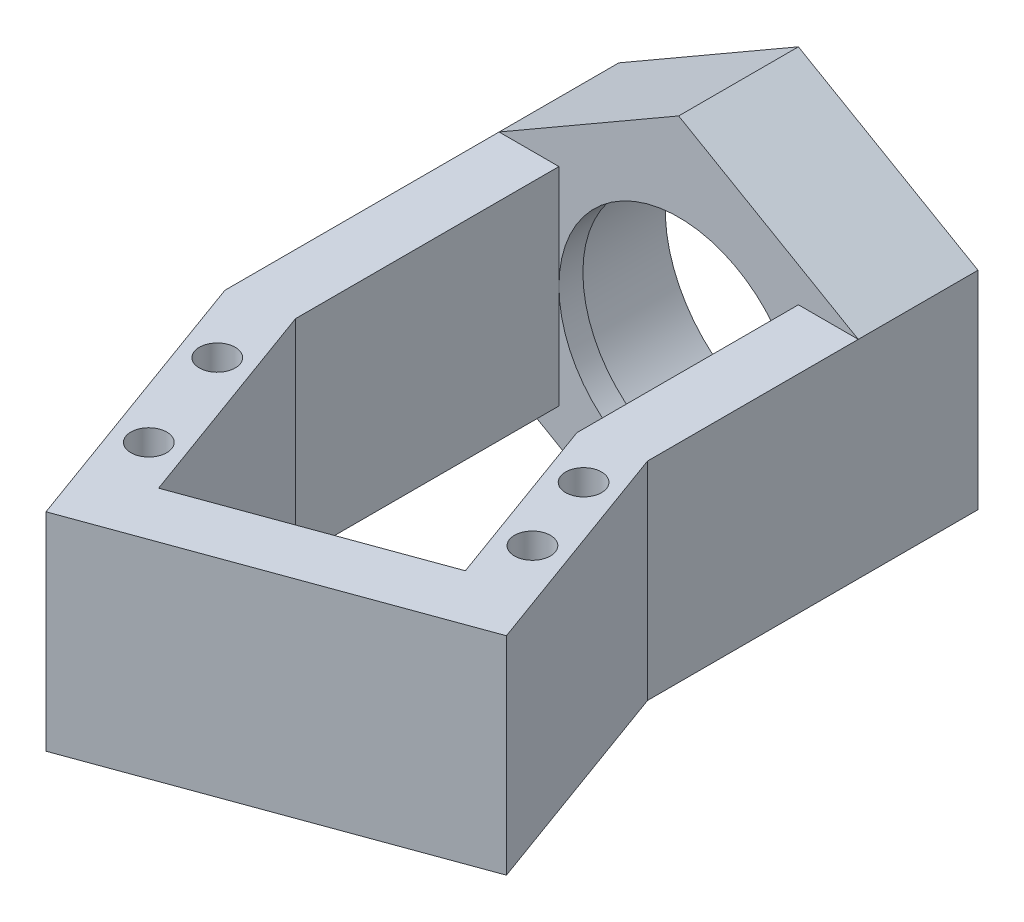
ISO-10303-21;
HEADER;
FILE_DESCRIPTION(('STEP AP214'),'2;1');
FILE_NAME('part.step','',(''),(''),'','','');
FILE_SCHEMA(('AUTOMOTIVE_DESIGN { 1 0 10303 214 1 1 1 1 }'));
ENDSEC;
DATA;
#1=APPLICATION_CONTEXT('core data for automotive mechanical design processes');
#2=APPLICATION_PROTOCOL_DEFINITION('international standard','automotive_design',2000,#1);
#3=PRODUCT_CONTEXT('',#1,'mechanical');
#4=PRODUCT('Part','Part','',(#3));
#5=PRODUCT_RELATED_PRODUCT_CATEGORY('part','',(#4));
#6=PRODUCT_DEFINITION_FORMATION('','',#4);
#7=PRODUCT_DEFINITION_CONTEXT('part definition',#1,'design');
#8=PRODUCT_DEFINITION('design','',#6,#7);
#9=PRODUCT_DEFINITION_SHAPE('','',#8);
#10=(LENGTH_UNIT() NAMED_UNIT(*) SI_UNIT(.MILLI.,.METRE.));
#11=(NAMED_UNIT(*) PLANE_ANGLE_UNIT() SI_UNIT($,.RADIAN.));
#12=(NAMED_UNIT(*) SI_UNIT($,.STERADIAN.) SOLID_ANGLE_UNIT());
#13=UNCERTAINTY_MEASURE_WITH_UNIT(LENGTH_MEASURE(1.E-05),#10,'distance_accuracy_value','');
#14=(GEOMETRIC_REPRESENTATION_CONTEXT(3) GLOBAL_UNCERTAINTY_ASSIGNED_CONTEXT((#13)) GLOBAL_UNIT_ASSIGNED_CONTEXT((#10,
#11,#12)) REPRESENTATION_CONTEXT('',''));
#15=CARTESIAN_POINT('',(0.,0.,0.));
#16=DIRECTION('',(0.,0.,1.));
#17=DIRECTION('',(1.,0.,0.));
#18=AXIS2_PLACEMENT_3D('',#15,#16,#17);
#19=CARTESIAN_POINT('',(0.,0.,10.));
#20=DIRECTION('',(0.,0.,1.));
#21=DIRECTION('',(1.,0.,0.));
#22=AXIS2_PLACEMENT_3D('',#19,#20,#21);
#23=PLANE('',#22);
#24=DIRECTION('',(0.866025403784439,0.5,0.));
#25=VECTOR('',#24,1.);
#26=CARTESIAN_POINT('',(0.,-17.3205080756888,10.));
#27=LINE('',#26,#25);
#28=CARTESIAN_POINT('',(0.,-17.3205080756888,10.));
#29=VERTEX_POINT('',#28);
#30=CARTESIAN_POINT('',(15.,-8.66025403784439,10.));
#31=VERTEX_POINT('',#30);
#32=EDGE_CURVE('E348',#29,#31,#27,.T.);
#33=ORIENTED_EDGE('',*,*,#32,.T.);
#34=DIRECTION('',(-1.,0.,0.));
#35=VECTOR('',#34,1.);
#36=CARTESIAN_POINT('',(10.,-8.66025403784439,10.));
#37=LINE('',#36,#35);
#38=CARTESIAN_POINT('',(10.,-8.66025403784439,10.));
#39=VERTEX_POINT('',#38);
#40=EDGE_CURVE('E64',#31,#39,#37,.T.);
#41=ORIENTED_EDGE('',*,*,#40,.T.);
#42=DIRECTION('',(0.,-1.,0.));
#43=VECTOR('',#42,1.);
#44=CARTESIAN_POINT('',(10.,8.66,10.));
#45=LINE('',#44,#43);
#46=CARTESIAN_POINT('',(10.,0.,10.));
#47=VERTEX_POINT('',#46);
#48=EDGE_CURVE('E11',#47,#39,#45,.T.);
#49=ORIENTED_EDGE('',*,*,#48,.F.);
#50=CARTESIAN_POINT('',(0.,0.,10.));
#51=DIRECTION('',(0.,0.,1.));
#52=DIRECTION('',(1.,0.,0.));
#53=AXIS2_PLACEMENT_3D('',#50,#51,#52);
#54=CIRCLE('',#53,10.);
#55=CARTESIAN_POINT('',(-9.99999999999999,0.,10.));
#56=VERTEX_POINT('',#55);
#57=EDGE_CURVE('E330',#56,#47,#54,.T.);
#58=ORIENTED_EDGE('',*,*,#57,.F.);
#59=DIRECTION('',(0.,-1.,0.));
#60=VECTOR('',#59,1.);
#61=CARTESIAN_POINT('',(-9.99999999999999,8.66,10.));
#62=LINE('',#61,#60);
#63=CARTESIAN_POINT('',(-9.99999999999999,-8.66025403784439,10.));
#64=VERTEX_POINT('',#63);
#65=EDGE_CURVE('E55',#56,#64,#62,.T.);
#66=ORIENTED_EDGE('',*,*,#65,.T.);
#67=DIRECTION('',(-1.,0.,0.));
#68=VECTOR('',#67,1.);
#69=CARTESIAN_POINT('',(-9.99999999999999,-8.66025403784439,10.));
#70=LINE('',#69,#68);
#71=CARTESIAN_POINT('',(-15.,-8.66025403784439,10.));
#72=VERTEX_POINT('',#71);
#73=EDGE_CURVE('E242',#64,#72,#70,.T.);
#74=ORIENTED_EDGE('',*,*,#73,.T.);
#75=DIRECTION('',(0.866025403784439,-0.5,0.));
#76=VECTOR('',#75,1.);
#77=CARTESIAN_POINT('',(-15.,-8.66025403784439,10.));
#78=LINE('',#77,#76);
#79=EDGE_CURVE('E344',#72,#29,#78,.T.);
#80=ORIENTED_EDGE('',*,*,#79,.T.);
#81=EDGE_LOOP('',(#33,#41,#49,#58,#66,#74,#80));
#82=FACE_BOUND('',#81,.T.);
#83=ADVANCED_FACE('F45',(#82),#23,.T.);
#84=CARTESIAN_POINT('',(10.,8.66,10.));
#85=VERTEX_POINT('',#84);
#86=EDGE_CURVE('E57',#85,#47,#45,.T.);
#87=ORIENTED_EDGE('',*,*,#86,.F.);
#88=DIRECTION('',(-1.,0.,0.));
#89=VECTOR('',#88,1.);
#90=CARTESIAN_POINT('',(10.,8.66,10.));
#91=LINE('',#90,#89);
#92=CARTESIAN_POINT('',(15.,8.66,10.));
#93=VERTEX_POINT('',#92);
#94=EDGE_CURVE('E255',#93,#85,#91,.T.);
#95=ORIENTED_EDGE('',*,*,#94,.F.);
#96=DIRECTION('',(0.,1.,0.));
#97=VECTOR('',#96,1.);
#98=CARTESIAN_POINT('',(15.,-8.66025403784439,10.));
#99=LINE('',#98,#97);
#100=CARTESIAN_POINT('',(15.,8.66025403784439,10.));
#101=VERTEX_POINT('',#100);
#102=EDGE_CURVE('E351',#93,#101,#99,.T.);
#103=ORIENTED_EDGE('',*,*,#102,.T.);
#104=DIRECTION('',(-0.866025403784439,0.5,0.));
#105=VECTOR('',#104,1.);
#106=CARTESIAN_POINT('',(15.,8.66025403784439,10.));
#107=LINE('',#106,#105);
#108=CARTESIAN_POINT('',(0.,17.3205080756888,10.));
#109=VERTEX_POINT('',#108);
#110=EDGE_CURVE('E329',#101,#109,#107,.T.);
#111=ORIENTED_EDGE('',*,*,#110,.T.);
#112=DIRECTION('',(-0.866025403784439,-0.5,0.));
#113=VECTOR('',#112,1.);
#114=CARTESIAN_POINT('',(0.,17.3205080756888,10.));
#115=LINE('',#114,#113);
#116=CARTESIAN_POINT('',(-15.,8.66025403784439,10.));
#117=VERTEX_POINT('',#116);
#118=EDGE_CURVE('E337',#109,#117,#115,.T.);
#119=ORIENTED_EDGE('',*,*,#118,.T.);
#120=DIRECTION('',(0.,-1.,0.));
#121=VECTOR('',#120,1.);
#122=CARTESIAN_POINT('',(-15.,8.66025403784439,10.));
#123=LINE('',#122,#121);
#124=CARTESIAN_POINT('',(-15.,8.66,10.));
#125=VERTEX_POINT('',#124);
#126=EDGE_CURVE('E341',#117,#125,#123,.T.);
#127=ORIENTED_EDGE('',*,*,#126,.T.);
#128=DIRECTION('',(-1.,0.,0.));
#129=VECTOR('',#128,1.);
#130=CARTESIAN_POINT('',(-9.99999999999999,8.66,10.));
#131=LINE('',#130,#129);
#132=CARTESIAN_POINT('',(-9.99999999999999,8.66,10.));
#133=VERTEX_POINT('',#132);
#134=EDGE_CURVE('E310',#133,#125,#131,.T.);
#135=ORIENTED_EDGE('',*,*,#134,.F.);
#136=EDGE_CURVE('E294',#133,#56,#62,.T.);
#137=ORIENTED_EDGE('',*,*,#136,.T.);
#138=EDGE_CURVE('E325',#47,#56,#54,.T.);
#139=ORIENTED_EDGE('',*,*,#138,.F.);
#140=EDGE_LOOP('',(#87,#95,#103,#111,#119,#127,#135,#137,#139));
#141=FACE_BOUND('',#140,.T.);
#142=ADVANCED_FACE('F432',(#141),#23,.T.);
#143=CARTESIAN_POINT('',(0.,0.,0.));
#144=DIRECTION('',(0.,0.,1.));
#145=DIRECTION('',(1.,0.,0.));
#146=AXIS2_PLACEMENT_3D('',#143,#144,#145);
#147=PLANE('',#146);
#148=DIRECTION('',(-0.866025403784439,0.5,0.));
#149=VECTOR('',#148,1.);
#150=CARTESIAN_POINT('',(15.,8.66025403784439,0.));
#151=LINE('',#150,#149);
#152=CARTESIAN_POINT('',(15.,8.66025403784439,0.));
#153=VERTEX_POINT('',#152);
#154=CARTESIAN_POINT('',(0.,17.3205080756888,0.));
#155=VERTEX_POINT('',#154);
#156=EDGE_CURVE('E362',#153,#155,#151,.T.);
#157=ORIENTED_EDGE('',*,*,#156,.F.);
#158=DIRECTION('',(0.,1.,0.));
#159=VECTOR('',#158,1.);
#160=CARTESIAN_POINT('',(15.,-8.66025403784439,0.));
#161=LINE('',#160,#159);
#162=CARTESIAN_POINT('',(15.,-8.66025403784439,0.));
#163=VERTEX_POINT('',#162);
#164=EDGE_CURVE('E378',#163,#153,#161,.T.);
#165=ORIENTED_EDGE('',*,*,#164,.F.);
#166=DIRECTION('',(0.866025403784439,0.5,0.));
#167=VECTOR('',#166,1.);
#168=CARTESIAN_POINT('',(0.,-17.3205080756888,0.));
#169=LINE('',#168,#167);
#170=CARTESIAN_POINT('',(0.,-17.3205080756888,0.));
#171=VERTEX_POINT('',#170);
#172=EDGE_CURVE('E375',#171,#163,#169,.T.);
#173=ORIENTED_EDGE('',*,*,#172,.F.);
#174=DIRECTION('',(0.866025403784439,-0.5,0.));
#175=VECTOR('',#174,1.);
#176=CARTESIAN_POINT('',(-15.,-8.66025403784439,0.));
#177=LINE('',#176,#175);
#178=CARTESIAN_POINT('',(-15.,-8.66025403784439,0.));
#179=VERTEX_POINT('',#178);
#180=EDGE_CURVE('E372',#179,#171,#177,.T.);
#181=ORIENTED_EDGE('',*,*,#180,.F.);
#182=DIRECTION('',(0.,-1.,0.));
#183=VECTOR('',#182,1.);
#184=CARTESIAN_POINT('',(-15.,8.66025403784439,0.));
#185=LINE('',#184,#183);
#186=CARTESIAN_POINT('',(-15.,8.66025403784439,0.));
#187=VERTEX_POINT('',#186);
#188=EDGE_CURVE('E369',#187,#179,#185,.T.);
#189=ORIENTED_EDGE('',*,*,#188,.F.);
#190=DIRECTION('',(-0.866025403784439,-0.5,0.));
#191=VECTOR('',#190,1.);
#192=CARTESIAN_POINT('',(0.,17.3205080756888,0.));
#193=LINE('',#192,#191);
#194=EDGE_CURVE('E366',#155,#187,#193,.T.);
#195=ORIENTED_EDGE('',*,*,#194,.F.);
#196=EDGE_LOOP('',(#157,#165,#173,#181,#189,#195));
#197=FACE_BOUND('',#196,.T.);
#198=CARTESIAN_POINT('',(0.,0.,0.));
#199=DIRECTION('',(0.,0.,1.));
#200=DIRECTION('',(1.,0.,0.));
#201=AXIS2_PLACEMENT_3D('',#198,#199,#200);
#202=CIRCLE('',#201,11.125);
#203=CARTESIAN_POINT('',(11.125,0.,0.));
#204=VERTEX_POINT('',#203);
#205=EDGE_CURVE('E358',#204,#204,#202,.T.);
#206=ORIENTED_EDGE('',*,*,#205,.T.);
#207=EDGE_LOOP('',(#206));
#208=FACE_BOUND('',#207,.T.);
#209=ADVANCED_FACE('F438',(#197,#208),#147,.F.);
#210=CARTESIAN_POINT('',(15.,8.66025403784439,8.));
#211=DIRECTION('',(-0.5,-0.866025403784439,0.));
#212=DIRECTION('',(0.866025403784439,-0.5,0.));
#213=AXIS2_PLACEMENT_3D('',#210,#211,#212);
#214=PLANE('',#213);
#215=ORIENTED_EDGE('',*,*,#156,.T.);
#216=DIRECTION('',(0.,0.,-1.));
#217=VECTOR('',#216,1.);
#218=CARTESIAN_POINT('',(0.,17.3205080756888,8.));
#219=LINE('',#218,#217);
#220=EDGE_CURVE('E401',#109,#155,#219,.T.);
#221=ORIENTED_EDGE('',*,*,#220,.F.);
#222=ORIENTED_EDGE('',*,*,#110,.F.);
#223=DIRECTION('',(0.,0.,-1.));
#224=VECTOR('',#223,1.);
#225=CARTESIAN_POINT('',(15.,8.66025403784439,8.));
#226=LINE('',#225,#224);
#227=EDGE_CURVE('E381',#101,#153,#226,.T.);
#228=ORIENTED_EDGE('',*,*,#227,.T.);
#229=EDGE_LOOP('',(#215,#221,#222,#228));
#230=FACE_BOUND('',#229,.T.);
#231=ADVANCED_FACE('F47',(#230),#214,.F.);
#232=CARTESIAN_POINT('',(0.,17.3205080756888,8.));
#233=DIRECTION('',(0.5,-0.866025403784439,0.));
#234=DIRECTION('',(0.866025403784439,0.5,0.));
#235=AXIS2_PLACEMENT_3D('',#232,#233,#234);
#236=PLANE('',#235);
#237=ORIENTED_EDGE('',*,*,#194,.T.);
#238=DIRECTION('',(0.,0.,-1.));
#239=VECTOR('',#238,1.);
#240=CARTESIAN_POINT('',(-15.,8.66025403784439,8.));
#241=LINE('',#240,#239);
#242=EDGE_CURVE('E397',#117,#187,#241,.T.);
#243=ORIENTED_EDGE('',*,*,#242,.F.);
#244=ORIENTED_EDGE('',*,*,#118,.F.);
#245=ORIENTED_EDGE('',*,*,#220,.T.);
#246=EDGE_LOOP('',(#237,#243,#244,#245));
#247=FACE_BOUND('',#246,.T.);
#248=ADVANCED_FACE('F468',(#247),#236,.F.);
#249=CARTESIAN_POINT('',(-15.,8.66025403784439,8.));
#250=DIRECTION('',(1.,0.,0.));
#251=DIRECTION('',(0.,1.,0.));
#252=AXIS2_PLACEMENT_3D('',#249,#250,#251);
#253=PLANE('',#252);
#254=ORIENTED_EDGE('',*,*,#188,.T.);
#255=DIRECTION('',(0.,0.,-1.));
#256=VECTOR('',#255,1.);
#257=CARTESIAN_POINT('',(-15.,-8.66025403784439,8.));
#258=LINE('',#257,#256);
#259=EDGE_CURVE('E393',#72,#179,#258,.T.);
#260=ORIENTED_EDGE('',*,*,#259,.F.);
#261=DIRECTION('',(0.,0.,1.));
#262=VECTOR('',#261,1.);
#263=CARTESIAN_POINT('',(-15.,-8.66025403784439,10.));
#264=LINE('',#263,#262);
#265=CARTESIAN_POINT('',(-15.,-8.66025403784439,32.9));
#266=VERTEX_POINT('',#265);
#267=EDGE_CURVE('E185',#72,#266,#264,.T.);
#268=ORIENTED_EDGE('',*,*,#267,.T.);
#269=DIRECTION('',(0.,-1.,0.));
#270=VECTOR('',#269,1.);
#271=CARTESIAN_POINT('',(-15.,8.66,32.9));
#272=LINE('',#271,#270);
#273=CARTESIAN_POINT('',(-15.,8.66,32.9));
#274=VERTEX_POINT('',#273);
#275=EDGE_CURVE('E180',#274,#266,#272,.T.);
#276=ORIENTED_EDGE('',*,*,#275,.F.);
#277=DIRECTION('',(0.,0.,1.));
#278=VECTOR('',#277,1.);
#279=CARTESIAN_POINT('',(-15.,8.66,10.));
#280=LINE('',#279,#278);
#281=EDGE_CURVE('E307',#125,#274,#280,.T.);
#282=ORIENTED_EDGE('',*,*,#281,.F.);
#283=ORIENTED_EDGE('',*,*,#126,.F.);
#284=ORIENTED_EDGE('',*,*,#242,.T.);
#285=EDGE_LOOP('',(#254,#260,#268,#276,#282,#283,#284));
#286=FACE_BOUND('',#285,.T.);
#287=ADVANCED_FACE('F465',(#286),#253,.F.);
#288=CARTESIAN_POINT('',(-15.,-8.66025403784439,8.));
#289=DIRECTION('',(0.5,0.866025403784439,0.));
#290=DIRECTION('',(-0.866025403784439,0.5,0.));
#291=AXIS2_PLACEMENT_3D('',#288,#289,#290);
#292=PLANE('',#291);
#293=ORIENTED_EDGE('',*,*,#180,.T.);
#294=DIRECTION('',(0.,0.,-1.));
#295=VECTOR('',#294,1.);
#296=CARTESIAN_POINT('',(0.,-17.3205080756888,8.));
#297=LINE('',#296,#295);
#298=EDGE_CURVE('E389',#29,#171,#297,.T.);
#299=ORIENTED_EDGE('',*,*,#298,.F.);
#300=ORIENTED_EDGE('',*,*,#79,.F.);
#301=ORIENTED_EDGE('',*,*,#259,.T.);
#302=EDGE_LOOP('',(#293,#299,#300,#301));
#303=FACE_BOUND('',#302,.T.);
#304=ADVANCED_FACE('F461',(#303),#292,.F.);
#305=CARTESIAN_POINT('',(0.,-17.3205080756888,8.));
#306=DIRECTION('',(-0.5,0.866025403784439,0.));
#307=DIRECTION('',(-0.866025403784439,-0.5,0.));
#308=AXIS2_PLACEMENT_3D('',#305,#306,#307);
#309=PLANE('',#308);
#310=ORIENTED_EDGE('',*,*,#172,.T.);
#311=DIRECTION('',(0.,0.,-1.));
#312=VECTOR('',#311,1.);
#313=CARTESIAN_POINT('',(15.,-8.66025403784439,8.));
#314=LINE('',#313,#312);
#315=EDGE_CURVE('E385',#31,#163,#314,.T.);
#316=ORIENTED_EDGE('',*,*,#315,.F.);
#317=ORIENTED_EDGE('',*,*,#32,.F.);
#318=ORIENTED_EDGE('',*,*,#298,.T.);
#319=EDGE_LOOP('',(#310,#316,#317,#318));
#320=FACE_BOUND('',#319,.T.);
#321=ADVANCED_FACE('F457',(#320),#309,.F.);
#322=CARTESIAN_POINT('',(15.,-8.66025403784439,8.));
#323=DIRECTION('',(-1.,0.,0.));
#324=DIRECTION('',(0.,-1.,0.));
#325=AXIS2_PLACEMENT_3D('',#322,#323,#324);
#326=PLANE('',#325);
#327=ORIENTED_EDGE('',*,*,#164,.T.);
#328=ORIENTED_EDGE('',*,*,#227,.F.);
#329=ORIENTED_EDGE('',*,*,#102,.F.);
#330=DIRECTION('',(0.,0.,-1.));
#331=VECTOR('',#330,1.);
#332=CARTESIAN_POINT('',(15.,8.66,10.));
#333=LINE('',#332,#331);
#334=CARTESIAN_POINT('',(15.,8.66,27.6));
#335=VERTEX_POINT('',#334);
#336=EDGE_CURVE('E268',#335,#93,#333,.T.);
#337=ORIENTED_EDGE('',*,*,#336,.F.);
#338=DIRECTION('',(0.,-1.,0.));
#339=VECTOR('',#338,1.);
#340=CARTESIAN_POINT('',(15.,8.66,27.6));
#341=LINE('',#340,#339);
#342=CARTESIAN_POINT('',(15.,-8.66025403784439,27.6));
#343=VERTEX_POINT('',#342);
#344=EDGE_CURVE('E272',#335,#343,#341,.T.);
#345=ORIENTED_EDGE('',*,*,#344,.T.);
#346=DIRECTION('',(0.,0.,-1.));
#347=VECTOR('',#346,1.);
#348=CARTESIAN_POINT('',(15.,-8.66025403784439,10.));
#349=LINE('',#348,#347);
#350=EDGE_CURVE('E251',#343,#31,#349,.T.);
#351=ORIENTED_EDGE('',*,*,#350,.T.);
#352=ORIENTED_EDGE('',*,*,#315,.T.);
#353=EDGE_LOOP('',(#327,#328,#329,#337,#345,#351,#352));
#354=FACE_BOUND('',#353,.T.);
#355=ADVANCED_FACE('F450',(#354),#326,.F.);
#356=CARTESIAN_POINT('',(0.,0.,8.));
#357=DIRECTION('',(0.,0.,-1.));
#358=DIRECTION('',(-1.,0.,0.));
#359=AXIS2_PLACEMENT_3D('',#356,#357,#358);
#360=CYLINDRICAL_SURFACE('',#359,11.125);
#361=CARTESIAN_POINT('',(0.,0.,8.));
#362=DIRECTION('',(0.,0.,1.));
#363=DIRECTION('',(1.,0.,0.));
#364=AXIS2_PLACEMENT_3D('',#361,#362,#363);
#365=CIRCLE('',#364,11.125);
#366=CARTESIAN_POINT('',(11.125,0.,8.));
#367=VERTEX_POINT('',#366);
#368=EDGE_CURVE('E354',#367,#367,#365,.T.);
#369=ORIENTED_EDGE('',*,*,#368,.T.);
#370=EDGE_LOOP('',(#369));
#371=FACE_BOUND('',#370,.T.);
#372=ORIENTED_EDGE('',*,*,#205,.F.);
#373=EDGE_LOOP('',(#372));
#374=FACE_BOUND('',#373,.T.);
#375=ADVANCED_FACE('F446',(#371,#374),#360,.F.);
#376=CARTESIAN_POINT('',(0.,0.,8.));
#377=DIRECTION('',(0.,0.,1.));
#378=DIRECTION('',(1.,0.,0.));
#379=AXIS2_PLACEMENT_3D('',#376,#377,#378);
#380=PLANE('',#379);
#381=CARTESIAN_POINT('',(0.,0.,8.));
#382=DIRECTION('',(0.,0.,1.));
#383=DIRECTION('',(1.,0.,0.));
#384=AXIS2_PLACEMENT_3D('',#381,#382,#383);
#385=CIRCLE('',#384,10.);
#386=CARTESIAN_POINT('',(10.,0.,8.));
#387=VERTEX_POINT('',#386);
#388=EDGE_CURVE('E284',#387,#387,#385,.T.);
#389=ORIENTED_EDGE('',*,*,#388,.T.);
#390=EDGE_LOOP('',(#389));
#391=FACE_BOUND('',#390,.T.);
#392=ORIENTED_EDGE('',*,*,#368,.F.);
#393=EDGE_LOOP('',(#392));
#394=FACE_BOUND('',#393,.T.);
#395=ADVANCED_FACE('F444',(#391,#394),#380,.F.);
#396=CARTESIAN_POINT('',(0.,0.,10.));
#397=DIRECTION('',(0.,0.,-1.));
#398=DIRECTION('',(-1.,0.,0.));
#399=AXIS2_PLACEMENT_3D('',#396,#397,#398);
#400=CYLINDRICAL_SURFACE('',#399,10.);
#401=ORIENTED_EDGE('',*,*,#138,.T.);
#402=ORIENTED_EDGE('',*,*,#57,.T.);
#403=EDGE_LOOP('',(#401,#402));
#404=FACE_BOUND('',#403,.T.);
#405=ORIENTED_EDGE('',*,*,#388,.F.);
#406=EDGE_LOOP('',(#405));
#407=FACE_BOUND('',#406,.T.);
#408=ADVANCED_FACE('F442',(#404,#407),#400,.F.);
#409=CARTESIAN_POINT('',(-15.,8.66,32.9));
#410=DIRECTION('',(0.939692620785908,0.,-0.34202014332567));
#411=DIRECTION('',(-0.34202014332567,0.,-0.939692620785908));
#412=AXIS2_PLACEMENT_3D('',#409,#410,#411);
#413=PLANE('',#412);
#414=ORIENTED_EDGE('',*,*,#275,.T.);
#415=DIRECTION('',(0.34202014332567,0.,0.939692620785908));
#416=VECTOR('',#415,1.);
#417=CARTESIAN_POINT('',(-15.,-8.66025403784439,32.9));
#418=LINE('',#417,#416);
#419=CARTESIAN_POINT('',(-6.44949641685823,-8.66025403784439,56.3923155196477));
#420=VERTEX_POINT('',#419);
#421=EDGE_CURVE('E173',#266,#420,#418,.T.);
#422=ORIENTED_EDGE('',*,*,#421,.T.);
#423=DIRECTION('',(0.,-1.,0.));
#424=VECTOR('',#423,1.);
#425=CARTESIAN_POINT('',(-6.44949641685823,-8.66025403784439,56.3923155196477));
#426=LINE('',#425,#424);
#427=CARTESIAN_POINT('',(-6.44949641685823,8.66,56.3923155196477));
#428=VERTEX_POINT('',#427);
#429=EDGE_CURVE('E178',#428,#420,#426,.T.);
#430=ORIENTED_EDGE('',*,*,#429,.F.);
#431=DIRECTION('',(0.34202014332567,0.,0.939692620785908));
#432=VECTOR('',#431,1.);
#433=CARTESIAN_POINT('',(-15.,8.66,32.9));
#434=LINE('',#433,#432);
#435=EDGE_CURVE('E304',#274,#428,#434,.T.);
#436=ORIENTED_EDGE('',*,*,#435,.F.);
#437=EDGE_LOOP('',(#414,#422,#430,#436));
#438=FACE_BOUND('',#437,.T.);
#439=ADVANCED_FACE('F175',(#438),#413,.F.);
#440=CARTESIAN_POINT('',(-3.4552316013302,8.66,49.9816033909053));
#441=DIRECTION('',(-0.939692620785908,0.,0.342020143325671));
#442=DIRECTION('',(0.342020143325671,0.,0.939692620785908));
#443=AXIS2_PLACEMENT_3D('',#440,#441,#442);
#444=PLANE('',#443);
#445=DIRECTION('',(0.,-1.,0.));
#446=VECTOR('',#445,1.);
#447=CARTESIAN_POINT('',(-3.4552316013302,8.66,49.9816033909053));
#448=LINE('',#447,#446);
#449=CARTESIAN_POINT('',(-3.4552316013302,8.66,49.9816033909053));
#450=VERTEX_POINT('',#449);
#451=CARTESIAN_POINT('',(-3.4552316013302,-8.66025403784439,49.9816033909053));
#452=VERTEX_POINT('',#451);
#453=EDGE_CURVE('E287',#450,#452,#448,.T.);
#454=ORIENTED_EDGE('',*,*,#453,.T.);
#455=DIRECTION('',(-0.342020143325671,0.,-0.939692620785908));
#456=VECTOR('',#455,1.);
#457=CARTESIAN_POINT('',(-3.4552316013302,-8.66025403784439,49.9816033909053));
#458=LINE('',#457,#456);
#459=CARTESIAN_POINT('',(-9.99999999999999,-8.66025403784439,32.));
#460=VERTEX_POINT('',#459);
#461=EDGE_CURVE('E186',#452,#460,#458,.T.);
#462=ORIENTED_EDGE('',*,*,#461,.T.);
#463=DIRECTION('',(0.,-1.,0.));
#464=VECTOR('',#463,1.);
#465=CARTESIAN_POINT('',(-9.99999999999999,8.66,32.));
#466=LINE('',#465,#464);
#467=CARTESIAN_POINT('',(-9.99999999999999,8.66,32.));
#468=VERTEX_POINT('',#467);
#469=EDGE_CURVE('E291',#468,#460,#466,.T.);
#470=ORIENTED_EDGE('',*,*,#469,.F.);
#471=DIRECTION('',(-0.342020143325671,0.,-0.939692620785908));
#472=VECTOR('',#471,1.);
#473=CARTESIAN_POINT('',(-3.4552316013302,8.66,49.9816033909053));
#474=LINE('',#473,#472);
#475=EDGE_CURVE('E301',#450,#468,#474,.T.);
#476=ORIENTED_EDGE('',*,*,#475,.F.);
#477=EDGE_LOOP('',(#454,#462,#470,#476));
#478=FACE_BOUND('',#477,.T.);
#479=ADVANCED_FACE('F505',(#478),#444,.F.);
#480=CARTESIAN_POINT('',(-9.99999999999999,8.66,32.));
#481=DIRECTION('',(-1.,0.,0.));
#482=DIRECTION('',(0.,0.,1.));
#483=AXIS2_PLACEMENT_3D('',#480,#481,#482);
#484=PLANE('',#483);
#485=ORIENTED_EDGE('',*,*,#469,.T.);
#486=DIRECTION('',(0.,0.,-1.));
#487=VECTOR('',#486,1.);
#488=CARTESIAN_POINT('',(-9.99999999999999,-8.66025403784439,32.));
#489=LINE('',#488,#487);
#490=EDGE_CURVE('E314',#460,#64,#489,.T.);
#491=ORIENTED_EDGE('',*,*,#490,.T.);
#492=ORIENTED_EDGE('',*,*,#65,.F.);
#493=ORIENTED_EDGE('',*,*,#136,.F.);
#494=DIRECTION('',(0.,0.,-1.));
#495=VECTOR('',#494,1.);
#496=CARTESIAN_POINT('',(-9.99999999999999,8.66,32.));
#497=LINE('',#496,#495);
#498=EDGE_CURVE('E297',#468,#133,#497,.T.);
#499=ORIENTED_EDGE('',*,*,#498,.F.);
#500=EDGE_LOOP('',(#485,#491,#492,#493,#499));
#501=FACE_BOUND('',#500,.T.);
#502=ADVANCED_FACE('F500',(#501),#484,.F.);
#503=CARTESIAN_POINT('',(10.,8.66,28.5));
#504=DIRECTION('',(1.,0.,0.));
#505=DIRECTION('',(0.,0.,-1.));
#506=AXIS2_PLACEMENT_3D('',#503,#504,#505);
#507=PLANE('',#506);
#508=ORIENTED_EDGE('',*,*,#86,.T.);
#509=ORIENTED_EDGE('',*,*,#48,.T.);
#510=DIRECTION('',(0.,0.,1.));
#511=VECTOR('',#510,1.);
#512=CARTESIAN_POINT('',(10.,-8.66025403784439,28.5));
#513=LINE('',#512,#511);
#514=CARTESIAN_POINT('',(10.,-8.66025403784439,28.5));
#515=VERTEX_POINT('',#514);
#516=EDGE_CURVE('E241',#39,#515,#513,.T.);
#517=ORIENTED_EDGE('',*,*,#516,.T.);
#518=DIRECTION('',(0.,-1.,0.));
#519=VECTOR('',#518,1.);
#520=CARTESIAN_POINT('',(10.,8.66,28.5));
#521=LINE('',#520,#519);
#522=CARTESIAN_POINT('',(10.,8.66,28.5));
#523=VERTEX_POINT('',#522);
#524=EDGE_CURVE('E279',#523,#515,#521,.T.);
#525=ORIENTED_EDGE('',*,*,#524,.F.);
#526=DIRECTION('',(0.,0.,1.));
#527=VECTOR('',#526,1.);
#528=CARTESIAN_POINT('',(10.,8.66,28.5));
#529=LINE('',#528,#527);
#530=EDGE_CURVE('E259',#85,#523,#529,.T.);
#531=ORIENTED_EDGE('',*,*,#530,.F.);
#532=EDGE_LOOP('',(#508,#509,#517,#525,#531));
#533=FACE_BOUND('',#532,.T.);
#534=ADVANCED_FACE('F517',(#533),#507,.F.);
#535=CARTESIAN_POINT('',(15.330091146811,8.66,43.1443050694981));
#536=DIRECTION('',(0.939692620785908,0.,-0.34202014332567));
#537=DIRECTION('',(-0.34202014332567,0.,-0.939692620785908));
#538=AXIS2_PLACEMENT_3D('',#535,#536,#537);
#539=PLANE('',#538);
#540=ORIENTED_EDGE('',*,*,#524,.T.);
#541=DIRECTION('',(0.34202014332567,0.,0.939692620785908));
#542=VECTOR('',#541,1.);
#543=CARTESIAN_POINT('',(15.330091146811,-8.66025403784439,43.1443050694981));
#544=LINE('',#543,#542);
#545=CARTESIAN_POINT('',(15.330091146811,-8.66025403784439,43.1443050694981));
#546=VERTEX_POINT('',#545);
#547=EDGE_CURVE('E246',#515,#546,#544,.T.);
#548=ORIENTED_EDGE('',*,*,#547,.T.);
#549=DIRECTION('',(0.,-1.,0.));
#550=VECTOR('',#549,1.);
#551=CARTESIAN_POINT('',(15.330091146811,8.66,43.1443050694981));
#552=LINE('',#551,#550);
#553=CARTESIAN_POINT('',(15.330091146811,8.66,43.1443050694981));
#554=VERTEX_POINT('',#553);
#555=EDGE_CURVE('E275',#554,#546,#552,.T.);
#556=ORIENTED_EDGE('',*,*,#555,.F.);
#557=DIRECTION('',(0.34202014332567,0.,0.939692620785908));
#558=VECTOR('',#557,1.);
#559=CARTESIAN_POINT('',(15.330091146811,8.66,43.1443050694981));
#560=LINE('',#559,#558);
#561=EDGE_CURVE('E262',#523,#554,#560,.T.);
#562=ORIENTED_EDGE('',*,*,#561,.F.);
#563=EDGE_LOOP('',(#540,#548,#556,#562));
#564=FACE_BOUND('',#563,.T.);
#565=ADVANCED_FACE('F513',(#564),#539,.F.);
#566=CARTESIAN_POINT('',(15.,8.66,27.6));
#567=DIRECTION('',(-0.939692620785908,0.,0.342020143325671));
#568=DIRECTION('',(0.342020143325671,0.,0.939692620785908));
#569=AXIS2_PLACEMENT_3D('',#566,#567,#568);
#570=PLANE('',#569);
#571=DIRECTION('',(-0.342020143325671,0.,-0.939692620785908));
#572=VECTOR('',#571,1.);
#573=CARTESIAN_POINT('',(15.,8.66,27.6));
#574=LINE('',#573,#572);
#575=CARTESIAN_POINT('',(21.7445573955957,8.66,46.1305191486149));
#576=VERTEX_POINT('',#575);
#577=EDGE_CURVE('E265',#576,#335,#574,.T.);
#578=ORIENTED_EDGE('',*,*,#577,.F.);
#579=DIRECTION('',(0.,1.,0.));
#580=VECTOR('',#579,1.);
#581=CARTESIAN_POINT('',(21.7445573955957,8.66,46.1305191486149));
#582=LINE('',#581,#580);
#583=CARTESIAN_POINT('',(21.7445573955957,-8.66025403784439,46.1305191486149));
#584=VERTEX_POINT('',#583);
#585=EDGE_CURVE('E199',#584,#576,#582,.T.);
#586=ORIENTED_EDGE('',*,*,#585,.F.);
#587=DIRECTION('',(-0.342020143325671,0.,-0.939692620785908));
#588=VECTOR('',#587,1.);
#589=CARTESIAN_POINT('',(15.,-8.66025403784439,27.6));
#590=LINE('',#589,#588);
#591=EDGE_CURVE('E194',#584,#343,#590,.T.);
#592=ORIENTED_EDGE('',*,*,#591,.T.);
#593=ORIENTED_EDGE('',*,*,#344,.F.);
#594=EDGE_LOOP('',(#578,#586,#592,#593));
#595=FACE_BOUND('',#594,.T.);
#596=ADVANCED_FACE('F494',(#595),#570,.F.);
#597=CARTESIAN_POINT('',(0.,8.66,0.));
#598=DIRECTION('',(0.,-1.,0.));
#599=DIRECTION('',(0.,0.,-1.));
#600=AXIS2_PLACEMENT_3D('',#597,#598,#599);
#601=PLANE('',#600);
#602=CARTESIAN_POINT('',(16.3141933395865,8.66,38.5294100739481));
#603=DIRECTION('',(0.,-1.,0.));
#604=DIRECTION('',(0.,0.,-1.));
#605=AXIS2_PLACEMENT_3D('',#602,#603,#604);
#606=CIRCLE('',#605,1.49999999999999);
#607=CARTESIAN_POINT('',(16.3141933395865,8.66,37.0294100739481));
#608=VERTEX_POINT('',#607);
#609=EDGE_CURVE('E226',#608,#608,#606,.T.);
#610=ORIENTED_EDGE('',*,*,#609,.T.);
#611=EDGE_LOOP('',(#610));
#612=FACE_BOUND('',#611,.T.);
#613=CARTESIAN_POINT('',(13.8680805733027,8.66,31.8087704831436));
#614=DIRECTION('',(0.,-1.,0.));
#615=DIRECTION('',(0.,0.,-1.));
#616=AXIS2_PLACEMENT_3D('',#613,#614,#615);
#617=CIRCLE('',#616,1.5);
#618=CARTESIAN_POINT('',(13.8680805733027,8.66,30.3087704831436));
#619=VERTEX_POINT('',#618);
#620=EDGE_CURVE('E221',#619,#619,#617,.T.);
#621=ORIENTED_EDGE('',*,*,#620,.T.);
#622=EDGE_LOOP('',(#621));
#623=FACE_BOUND('',#622,.T.);
#624=ORIENTED_EDGE('',*,*,#94,.T.);
#625=ORIENTED_EDGE('',*,*,#530,.T.);
#626=ORIENTED_EDGE('',*,*,#561,.T.);
#627=DIRECTION('',(-0.939692620785908,0.,0.34202014332567));
#628=VECTOR('',#627,1.);
#629=CARTESIAN_POINT('',(-8.15959713348658,8.66,51.6938524157182));
#630=LINE('',#629,#628);
#631=EDGE_CURVE('E206',#554,#450,#630,.T.);
#632=ORIENTED_EDGE('',*,*,#631,.T.);
#633=ORIENTED_EDGE('',*,*,#475,.T.);
#634=ORIENTED_EDGE('',*,*,#498,.T.);
#635=ORIENTED_EDGE('',*,*,#134,.T.);
#636=ORIENTED_EDGE('',*,*,#281,.T.);
#637=ORIENTED_EDGE('',*,*,#435,.T.);
#638=DIRECTION('',(-0.939692620785908,0.,0.34202014332567));
#639=VECTOR('',#638,1.);
#640=CARTESIAN_POINT('',(-6.44949641685823,8.66,56.3923155196477));
#641=LINE('',#640,#639);
#642=EDGE_CURVE('E204',#576,#428,#641,.T.);
#643=ORIENTED_EDGE('',*,*,#642,.F.);
#644=ORIENTED_EDGE('',*,*,#577,.T.);
#645=ORIENTED_EDGE('',*,*,#336,.T.);
#646=EDGE_LOOP('',(#624,#625,#626,#632,#633,#634,#635,#636,#637,#643,#644,#645));
#647=FACE_BOUND('',#646,.T.);
#648=CARTESIAN_POINT('',(-10.447879140046,8.66,38.0881557247154));
#649=DIRECTION('',(0.,1.,0.));
#650=DIRECTION('',(0.,0.,1.));
#651=AXIS2_PLACEMENT_3D('',#648,#649,#650);
#652=CIRCLE('',#651,1.5);
#653=CARTESIAN_POINT('',(-10.447879140046,8.66,39.5881557247154));
#654=VERTEX_POINT('',#653);
#655=EDGE_CURVE('E235',#654,#654,#652,.T.);
#656=ORIENTED_EDGE('',*,*,#655,.F.);
#657=EDGE_LOOP('',(#656));
#658=FACE_BOUND('',#657,.T.);
#659=CARTESIAN_POINT('',(-7.17549494071107,8.66,47.0789574201681));
#660=DIRECTION('',(0.,1.,0.));
#661=DIRECTION('',(0.,0.,1.));
#662=AXIS2_PLACEMENT_3D('',#659,#660,#661);
#663=CIRCLE('',#662,1.5);
#664=CARTESIAN_POINT('',(-7.17549494071107,8.66,48.5789574201681));
#665=VERTEX_POINT('',#664);
#666=EDGE_CURVE('E231',#665,#665,#663,.T.);
#667=ORIENTED_EDGE('',*,*,#666,.F.);
#668=EDGE_LOOP('',(#667));
#669=FACE_BOUND('',#668,.T.);
#670=ADVANCED_FACE('F496',(#612,#623,#647,#658,#669),#601,.F.);
#671=CARTESIAN_POINT('',(0.,-8.66025403784439,0.));
#672=DIRECTION('',(0.,-1.,0.));
#673=DIRECTION('',(0.,0.,-1.));
#674=AXIS2_PLACEMENT_3D('',#671,#672,#673);
#675=PLANE('',#674);
#676=CARTESIAN_POINT('',(16.3141933395865,-8.66025403784439,38.5294100739481));
#677=DIRECTION('',(0.,-1.,0.));
#678=DIRECTION('',(0.,0.,-1.));
#679=AXIS2_PLACEMENT_3D('',#676,#677,#678);
#680=CIRCLE('',#679,1.49999999999999);
#681=CARTESIAN_POINT('',(16.3141933395865,-8.66025403784439,37.0294100739481));
#682=VERTEX_POINT('',#681);
#683=EDGE_CURVE('E225',#682,#682,#680,.T.);
#684=ORIENTED_EDGE('',*,*,#683,.F.);
#685=EDGE_LOOP('',(#684));
#686=FACE_BOUND('',#685,.T.);
#687=CARTESIAN_POINT('',(13.8680805733027,-8.66025403784439,31.8087704831436));
#688=DIRECTION('',(0.,-1.,0.));
#689=DIRECTION('',(0.,0.,-1.));
#690=AXIS2_PLACEMENT_3D('',#687,#688,#689);
#691=CIRCLE('',#690,1.5);
#692=CARTESIAN_POINT('',(13.8680805733027,-8.66025403784439,30.3087704831436));
#693=VERTEX_POINT('',#692);
#694=EDGE_CURVE('E217',#693,#693,#691,.T.);
#695=ORIENTED_EDGE('',*,*,#694,.F.);
#696=EDGE_LOOP('',(#695));
#697=FACE_BOUND('',#696,.T.);
#698=ORIENTED_EDGE('',*,*,#40,.F.);
#699=ORIENTED_EDGE('',*,*,#350,.F.);
#700=ORIENTED_EDGE('',*,*,#591,.F.);
#701=DIRECTION('',(0.939692620785908,0.,-0.34202014332567));
#702=VECTOR('',#701,1.);
#703=CARTESIAN_POINT('',(21.7445573955957,-8.66025403784439,46.1305191486149));
#704=LINE('',#703,#702);
#705=EDGE_CURVE('E189',#420,#584,#704,.T.);
#706=ORIENTED_EDGE('',*,*,#705,.F.);
#707=ORIENTED_EDGE('',*,*,#421,.F.);
#708=ORIENTED_EDGE('',*,*,#267,.F.);
#709=ORIENTED_EDGE('',*,*,#73,.F.);
#710=ORIENTED_EDGE('',*,*,#490,.F.);
#711=ORIENTED_EDGE('',*,*,#461,.F.);
#712=DIRECTION('',(0.939692620785908,0.,-0.34202014332567));
#713=VECTOR('',#712,1.);
#714=CARTESIAN_POINT('',(20.0344566789674,-8.66025403784439,41.4320560446853));
#715=LINE('',#714,#713);
#716=EDGE_CURVE('E210',#452,#546,#715,.T.);
#717=ORIENTED_EDGE('',*,*,#716,.T.);
#718=ORIENTED_EDGE('',*,*,#547,.F.);
#719=ORIENTED_EDGE('',*,*,#516,.F.);
#720=EDGE_LOOP('',(#698,#699,#700,#706,#707,#708,#709,#710,#711,#717,#718,#719));
#721=FACE_BOUND('',#720,.T.);
#722=CARTESIAN_POINT('',(-10.447879140046,-8.66025403784439,38.0881557247154));
#723=DIRECTION('',(0.,1.,0.));
#724=DIRECTION('',(0.,0.,1.));
#725=AXIS2_PLACEMENT_3D('',#722,#723,#724);
#726=CIRCLE('',#725,1.5);
#727=CARTESIAN_POINT('',(-10.447879140046,-8.66025403784439,39.5881557247154));
#728=VERTEX_POINT('',#727);
#729=EDGE_CURVE('E49',#728,#728,#726,.T.);
#730=ORIENTED_EDGE('',*,*,#729,.T.);
#731=EDGE_LOOP('',(#730));
#732=FACE_BOUND('',#731,.T.);
#733=CARTESIAN_POINT('',(-7.17549494071107,-8.66025403784439,47.0789574201681));
#734=DIRECTION('',(0.,1.,0.));
#735=DIRECTION('',(0.,0.,1.));
#736=AXIS2_PLACEMENT_3D('',#733,#734,#735);
#737=CIRCLE('',#736,1.5);
#738=CARTESIAN_POINT('',(-7.17549494071107,-8.66025403784439,48.5789574201681));
#739=VERTEX_POINT('',#738);
#740=EDGE_CURVE('E230',#739,#739,#737,.T.);
#741=ORIENTED_EDGE('',*,*,#740,.T.);
#742=EDGE_LOOP('',(#741));
#743=FACE_BOUND('',#742,.T.);
#744=ADVANCED_FACE('F190',(#686,#697,#721,#732,#743),#675,.T.);
#745=CARTESIAN_POINT('',(13.8680805733027,17.3205080756888,31.8087704831436));
#746=DIRECTION('',(0.,-1.,0.));
#747=DIRECTION('',(0.,0.,-1.));
#748=AXIS2_PLACEMENT_3D('',#745,#746,#747);
#749=CYLINDRICAL_SURFACE('',#748,1.5);
#750=ORIENTED_EDGE('',*,*,#694,.T.);
#751=EDGE_LOOP('',(#750));
#752=FACE_BOUND('',#751,.T.);
#753=ORIENTED_EDGE('',*,*,#620,.F.);
#754=EDGE_LOOP('',(#753));
#755=FACE_BOUND('',#754,.T.);
#756=ADVANCED_FACE('F428',(#752,#755),#749,.F.);
#757=CARTESIAN_POINT('',(16.3141933395865,17.3205080756888,38.5294100739481));
#758=DIRECTION('',(0.,-1.,0.));
#759=DIRECTION('',(0.,0.,-1.));
#760=AXIS2_PLACEMENT_3D('',#757,#758,#759);
#761=CYLINDRICAL_SURFACE('',#760,1.49999999999999);
#762=ORIENTED_EDGE('',*,*,#683,.T.);
#763=EDGE_LOOP('',(#762));
#764=FACE_BOUND('',#763,.T.);
#765=ORIENTED_EDGE('',*,*,#609,.F.);
#766=EDGE_LOOP('',(#765));
#767=FACE_BOUND('',#766,.T.);
#768=ADVANCED_FACE('F418',(#764,#767),#761,.F.);
#769=CARTESIAN_POINT('',(-7.17549494071107,17.3205080756888,47.0789574201681));
#770=DIRECTION('',(0.,-1.,0.));
#771=DIRECTION('',(0.,0.,-1.));
#772=AXIS2_PLACEMENT_3D('',#769,#770,#771);
#773=CYLINDRICAL_SURFACE('',#772,1.5);
#774=ORIENTED_EDGE('',*,*,#666,.T.);
#775=EDGE_LOOP('',(#774));
#776=FACE_BOUND('',#775,.T.);
#777=ORIENTED_EDGE('',*,*,#740,.F.);
#778=EDGE_LOOP('',(#777));
#779=FACE_BOUND('',#778,.T.);
#780=ADVANCED_FACE('F415',(#776,#779),#773,.F.);
#781=CARTESIAN_POINT('',(-10.447879140046,17.3205080756888,38.0881557247154));
#782=DIRECTION('',(0.,-1.,0.));
#783=DIRECTION('',(0.,0.,-1.));
#784=AXIS2_PLACEMENT_3D('',#781,#782,#783);
#785=CYLINDRICAL_SURFACE('',#784,1.5);
#786=ORIENTED_EDGE('',*,*,#655,.T.);
#787=EDGE_LOOP('',(#786));
#788=FACE_BOUND('',#787,.T.);
#789=ORIENTED_EDGE('',*,*,#729,.F.);
#790=EDGE_LOOP('',(#789));
#791=FACE_BOUND('',#790,.T.);
#792=ADVANCED_FACE('F417',(#788,#791),#785,.F.);
#793=CARTESIAN_POINT('',(15.6595923692494,0.,43.0243764323763));
#794=DIRECTION('',(-0.34202014332567,0.,-0.939692620785908));
#795=DIRECTION('',(-0.939692620785908,0.,0.34202014332567));
#796=AXIS2_PLACEMENT_3D('',#793,#794,#795);
#797=PLANE('',#796);
#798=ORIENTED_EDGE('',*,*,#453,.F.);
#799=ORIENTED_EDGE('',*,*,#631,.F.);
#800=ORIENTED_EDGE('',*,*,#555,.T.);
#801=ORIENTED_EDGE('',*,*,#716,.F.);
#802=EDGE_LOOP('',(#798,#799,#800,#801));
#803=FACE_BOUND('',#802,.T.);
#804=ADVANCED_FACE('F425',(#803),#797,.T.);
#805=CARTESIAN_POINT('',(17.3696930858777,0.,47.7228395363058));
#806=DIRECTION('',(-0.34202014332567,0.,-0.939692620785908));
#807=DIRECTION('',(-0.939692620785908,0.,0.34202014332567));
#808=AXIS2_PLACEMENT_3D('',#805,#806,#807);
#809=PLANE('',#808);
#810=ORIENTED_EDGE('',*,*,#429,.T.);
#811=ORIENTED_EDGE('',*,*,#705,.T.);
#812=ORIENTED_EDGE('',*,*,#585,.T.);
#813=ORIENTED_EDGE('',*,*,#642,.T.);
#814=EDGE_LOOP('',(#810,#811,#812,#813));
#815=FACE_BOUND('',#814,.T.);
#816=ADVANCED_FACE('F202',(#815),#809,.F.);
#817=CLOSED_SHELL('',(#83,#142,#209,#231,#248,#287,#304,#321,#355,#375,#395,#408,#439,#479,#502,
#534,#565,#596,#670,#744,#756,#768,#780,#792,#804,#816));
#818=MANIFOLD_SOLID_BREP('B2',#817);
#819=ADVANCED_BREP_SHAPE_REPRESENTATION('',(#18,#818),#14);
#820=SHAPE_DEFINITION_REPRESENTATION(#9,#819);
ENDSEC;
END-ISO-10303-21;
